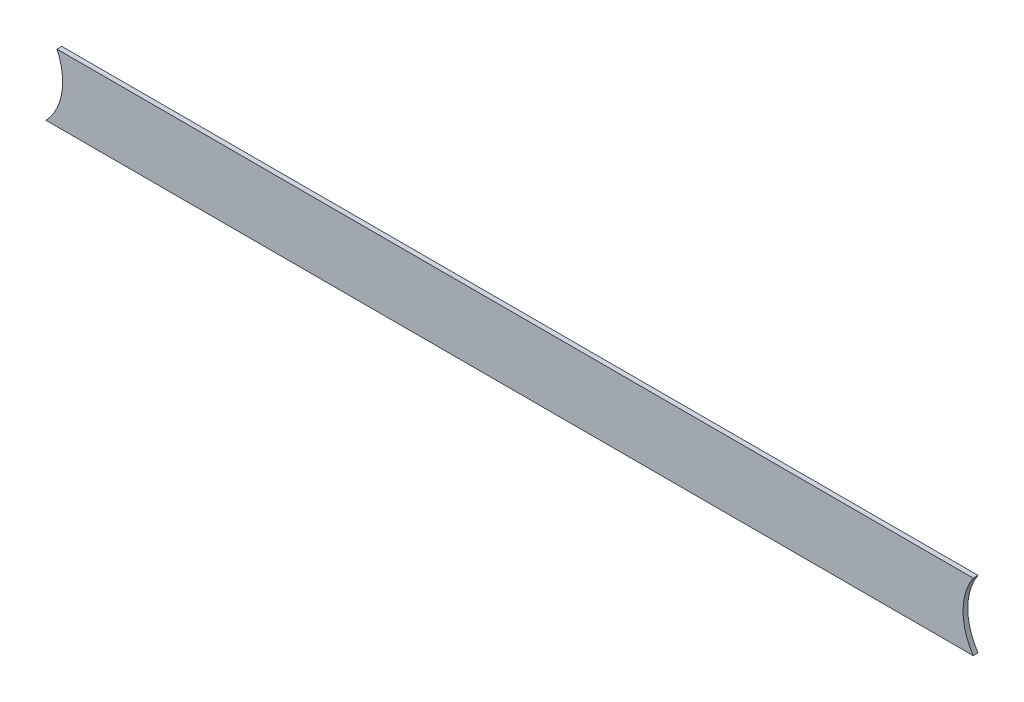
ISO-10303-21;
HEADER;
FILE_DESCRIPTION(('STEP AP214'),'2;1');
FILE_NAME('part.step','',(''),(''),'','','');
FILE_SCHEMA(('AUTOMOTIVE_DESIGN { 1 0 10303 214 1 1 1 1 }'));
ENDSEC;
DATA;
#1=APPLICATION_CONTEXT('core data for automotive mechanical design processes');
#2=APPLICATION_PROTOCOL_DEFINITION('international standard','automotive_design',2000,#1);
#3=PRODUCT_CONTEXT('',#1,'mechanical');
#4=PRODUCT('Part','Part','',(#3));
#5=PRODUCT_RELATED_PRODUCT_CATEGORY('part','',(#4));
#6=PRODUCT_DEFINITION_FORMATION('','',#4);
#7=PRODUCT_DEFINITION_CONTEXT('part definition',#1,'design');
#8=PRODUCT_DEFINITION('design','',#6,#7);
#9=PRODUCT_DEFINITION_SHAPE('','',#8);
#10=(LENGTH_UNIT() NAMED_UNIT(*) SI_UNIT(.MILLI.,.METRE.));
#11=(NAMED_UNIT(*) PLANE_ANGLE_UNIT() SI_UNIT($,.RADIAN.));
#12=(NAMED_UNIT(*) SI_UNIT($,.STERADIAN.) SOLID_ANGLE_UNIT());
#13=UNCERTAINTY_MEASURE_WITH_UNIT(LENGTH_MEASURE(1.E-05),#10,'distance_accuracy_value','');
#14=(GEOMETRIC_REPRESENTATION_CONTEXT(3) GLOBAL_UNCERTAINTY_ASSIGNED_CONTEXT((#13)) GLOBAL_UNIT_ASSIGNED_CONTEXT((#10,
#11,#12)) REPRESENTATION_CONTEXT('',''));
#15=CARTESIAN_POINT('',(0.,0.,0.));
#16=DIRECTION('',(0.,0.,1.));
#17=DIRECTION('',(1.,0.,0.));
#18=AXIS2_PLACEMENT_3D('',#15,#16,#17);
#19=CARTESIAN_POINT('',(36.1832219040097,68.1500161,0.));
#20=DIRECTION('',(0.,1.,0.));
#21=DIRECTION('',(1.,0.,0.));
#22=AXIS2_PLACEMENT_3D('',#19,#20,#21);
#23=PLANE('',#22);
#24=DIRECTION('',(1.,0.,0.));
#25=VECTOR('',#24,1.);
#26=CARTESIAN_POINT('',(35.9170224,68.1500161,0.03556));
#27=LINE('',#26,#25);
#28=CARTESIAN_POINT('',(36.1832219040096,68.1500161,0.03556));
#29=VERTEX_POINT('',#28);
#30=CARTESIAN_POINT('',(43.0858446096541,68.1500161,0.03556));
#31=VERTEX_POINT('',#30);
#32=EDGE_CURVE('E11',#29,#31,#27,.T.);
#33=ORIENTED_EDGE('',*,*,#32,.F.);
#34=DIRECTION('',(0.,0.,1.));
#35=VECTOR('',#34,1.);
#36=CARTESIAN_POINT('',(36.1832219040096,68.1500161,0.));
#37=LINE('',#36,#35);
#38=CARTESIAN_POINT('',(36.1832219040096,68.1500161,0.));
#39=VERTEX_POINT('',#38);
#40=EDGE_CURVE('E24',#39,#29,#37,.T.);
#41=ORIENTED_EDGE('',*,*,#40,.F.);
#42=DIRECTION('',(1.,0.,0.));
#43=VECTOR('',#42,1.);
#44=CARTESIAN_POINT('',(35.9170224,68.1500161,0.));
#45=LINE('',#44,#43);
#46=CARTESIAN_POINT('',(43.0858446096541,68.1500161,0.));
#47=VERTEX_POINT('',#46);
#48=EDGE_CURVE('E82',#39,#47,#45,.T.);
#49=ORIENTED_EDGE('',*,*,#48,.T.);
#50=DIRECTION('',(0.,0.,1.));
#51=VECTOR('',#50,1.);
#52=CARTESIAN_POINT('',(43.0858446096541,68.1500161,0.));
#53=LINE('',#52,#51);
#54=EDGE_CURVE('E37',#47,#31,#53,.T.);
#55=ORIENTED_EDGE('',*,*,#54,.T.);
#56=EDGE_LOOP('',(#33,#41,#49,#55));
#57=FACE_BOUND('',#56,.T.);
#58=ADVANCED_FACE('F17',(#57),#23,.F.);
#59=CARTESIAN_POINT('',(43.4600096,68.4000156,0.));
#60=DIRECTION('',(0.,0.,-1.));
#61=DIRECTION('',(1.,0.,0.));
#62=AXIS2_PLACEMENT_3D('',#59,#60,#61);
#63=CYLINDRICAL_SURFACE('',#62,0.4499991);
#64=DIRECTION('',(0.,0.,1.));
#65=VECTOR('',#64,1.);
#66=CARTESIAN_POINT('',(43.0858446096541,68.6500151,0.));
#67=LINE('',#66,#65);
#68=CARTESIAN_POINT('',(43.0858446096541,68.6500151,0.));
#69=VERTEX_POINT('',#68);
#70=CARTESIAN_POINT('',(43.0858446096541,68.6500151,0.03556));
#71=VERTEX_POINT('',#70);
#72=EDGE_CURVE('E97',#69,#71,#67,.T.);
#73=ORIENTED_EDGE('',*,*,#72,.T.);
#74=CARTESIAN_POINT('',(43.4600096,68.4000156,0.03556));
#75=DIRECTION('',(0.,0.,1.));
#76=DIRECTION('',(1.,0.,0.));
#77=AXIS2_PLACEMENT_3D('',#74,#75,#76);
#78=CIRCLE('',#77,0.4499991);
#79=EDGE_CURVE('E94',#71,#31,#78,.T.);
#80=ORIENTED_EDGE('',*,*,#79,.T.);
#81=ORIENTED_EDGE('',*,*,#54,.F.);
#82=CARTESIAN_POINT('',(43.4600096,68.4000156,0.));
#83=DIRECTION('',(0.,0.,1.));
#84=DIRECTION('',(1.,0.,0.));
#85=AXIS2_PLACEMENT_3D('',#82,#83,#84);
#86=CIRCLE('',#85,0.4499991);
#87=EDGE_CURVE('E92',#69,#47,#86,.T.);
#88=ORIENTED_EDGE('',*,*,#87,.F.);
#89=EDGE_LOOP('',(#73,#80,#81,#88));
#90=FACE_BOUND('',#89,.T.);
#91=ADVANCED_FACE('F102',(#90),#63,.F.);
#92=CARTESIAN_POINT('',(43.0858446096541,68.6500151,0.));
#93=DIRECTION('',(0.,-1.,0.));
#94=DIRECTION('',(-1.,0.,0.));
#95=AXIS2_PLACEMENT_3D('',#92,#93,#94);
#96=PLANE('',#95);
#97=DIRECTION('',(-1.,0.,0.));
#98=VECTOR('',#97,1.);
#99=CARTESIAN_POINT('',(43.4600096,68.6500151,0.03556));
#100=LINE('',#99,#98);
#101=CARTESIAN_POINT('',(36.2649459790646,68.6500151,0.03556));
#102=VERTEX_POINT('',#101);
#103=EDGE_CURVE('E89',#71,#102,#100,.T.);
#104=ORIENTED_EDGE('',*,*,#103,.F.);
#105=ORIENTED_EDGE('',*,*,#72,.F.);
#106=DIRECTION('',(-1.,0.,0.));
#107=VECTOR('',#106,1.);
#108=CARTESIAN_POINT('',(43.4600096,68.6500151,0.));
#109=LINE('',#108,#107);
#110=CARTESIAN_POINT('',(36.2649459790646,68.6500151,0.));
#111=VERTEX_POINT('',#110);
#112=EDGE_CURVE('E87',#69,#111,#109,.T.);
#113=ORIENTED_EDGE('',*,*,#112,.T.);
#114=DIRECTION('',(0.,0.,1.));
#115=VECTOR('',#114,1.);
#116=CARTESIAN_POINT('',(36.2649459790646,68.6500151,0.));
#117=LINE('',#116,#115);
#118=EDGE_CURVE('E69',#111,#102,#117,.T.);
#119=ORIENTED_EDGE('',*,*,#118,.T.);
#120=EDGE_LOOP('',(#104,#105,#113,#119));
#121=FACE_BOUND('',#120,.T.);
#122=ADVANCED_FACE('F108',(#121),#96,.F.);
#123=CARTESIAN_POINT('',(35.8570276,68.4600104,0.));
#124=DIRECTION('',(0.,0.,-1.));
#125=DIRECTION('',(1.,0.,0.));
#126=AXIS2_PLACEMENT_3D('',#123,#124,#125);
#127=CYLINDRICAL_SURFACE('',#126,0.4499991);
#128=DIRECTION('',(0.,0.,1.));
#129=VECTOR('',#128,1.);
#130=CARTESIAN_POINT('',(36.3070267,68.4600104,0.));
#131=LINE('',#130,#129);
#132=CARTESIAN_POINT('',(36.3070267,68.4600104,0.));
#133=VERTEX_POINT('',#132);
#134=CARTESIAN_POINT('',(36.3070267,68.4600104,0.03556));
#135=VERTEX_POINT('',#134);
#136=EDGE_CURVE('E59',#133,#135,#131,.T.);
#137=ORIENTED_EDGE('',*,*,#136,.T.);
#138=CARTESIAN_POINT('',(35.8570276,68.4600104,0.03556));
#139=DIRECTION('',(0.,0.,1.));
#140=DIRECTION('',(1.,0.,0.));
#141=AXIS2_PLACEMENT_3D('',#138,#139,#140);
#142=CIRCLE('',#141,0.4499991);
#143=EDGE_CURVE('E70',#135,#102,#142,.T.);
#144=ORIENTED_EDGE('',*,*,#143,.T.);
#145=ORIENTED_EDGE('',*,*,#118,.F.);
#146=CARTESIAN_POINT('',(35.8570276,68.4600104,0.));
#147=DIRECTION('',(0.,0.,1.));
#148=DIRECTION('',(1.,0.,0.));
#149=AXIS2_PLACEMENT_3D('',#146,#147,#148);
#150=CIRCLE('',#149,0.4499991);
#151=EDGE_CURVE('E73',#133,#111,#150,.T.);
#152=ORIENTED_EDGE('',*,*,#151,.F.);
#153=EDGE_LOOP('',(#137,#144,#145,#152));
#154=FACE_BOUND('',#153,.T.);
#155=ADVANCED_FACE('F74',(#154),#127,.F.);
#156=CARTESIAN_POINT('',(35.8570276,68.4600104,0.));
#157=DIRECTION('',(0.,0.,-1.));
#158=DIRECTION('',(1.,0.,0.));
#159=AXIS2_PLACEMENT_3D('',#156,#157,#158);
#160=CYLINDRICAL_SURFACE('',#159,0.4499991);
#161=ORIENTED_EDGE('',*,*,#40,.T.);
#162=CARTESIAN_POINT('',(35.8570276,68.4600104,0.03556));
#163=DIRECTION('',(0.,0.,1.));
#164=DIRECTION('',(1.,0.,0.));
#165=AXIS2_PLACEMENT_3D('',#162,#163,#164);
#166=CIRCLE('',#165,0.4499991);
#167=EDGE_CURVE('E65',#29,#135,#166,.T.);
#168=ORIENTED_EDGE('',*,*,#167,.T.);
#169=ORIENTED_EDGE('',*,*,#136,.F.);
#170=EDGE_CURVE('E63',#39,#133,#150,.T.);
#171=ORIENTED_EDGE('',*,*,#170,.F.);
#172=EDGE_LOOP('',(#161,#168,#169,#171));
#173=FACE_BOUND('',#172,.T.);
#174=ADVANCED_FACE('F61',(#173),#160,.F.);
#175=CARTESIAN_POINT('',(35.9170224,68.1500161,0.));
#176=DIRECTION('',(0.,0.,-1.));
#177=DIRECTION('',(-1.,0.,0.));
#178=AXIS2_PLACEMENT_3D('',#175,#176,#177);
#179=PLANE('',#178);
#180=ORIENTED_EDGE('',*,*,#48,.F.);
#181=ORIENTED_EDGE('',*,*,#170,.T.);
#182=ORIENTED_EDGE('',*,*,#151,.T.);
#183=ORIENTED_EDGE('',*,*,#112,.F.);
#184=ORIENTED_EDGE('',*,*,#87,.T.);
#185=EDGE_LOOP('',(#180,#181,#182,#183,#184));
#186=FACE_BOUND('',#185,.T.);
#187=ADVANCED_FACE('F80',(#186),#179,.T.);
#188=CARTESIAN_POINT('',(35.9170224,68.1500161,0.03556));
#189=DIRECTION('',(0.,0.,-1.));
#190=DIRECTION('',(-1.,0.,0.));
#191=AXIS2_PLACEMENT_3D('',#188,#189,#190);
#192=PLANE('',#191);
#193=ORIENTED_EDGE('',*,*,#167,.F.);
#194=ORIENTED_EDGE('',*,*,#32,.T.);
#195=ORIENTED_EDGE('',*,*,#79,.F.);
#196=ORIENTED_EDGE('',*,*,#103,.T.);
#197=ORIENTED_EDGE('',*,*,#143,.F.);
#198=EDGE_LOOP('',(#193,#194,#195,#196,#197));
#199=FACE_BOUND('',#198,.T.);
#200=ADVANCED_FACE('F106',(#199),#192,.F.);
#201=CLOSED_SHELL('',(#58,#91,#122,#155,#174,#187,#200));
#202=MANIFOLD_SOLID_BREP('B1',#201);
#203=ADVANCED_BREP_SHAPE_REPRESENTATION('',(#18,#202),#14);
#204=SHAPE_DEFINITION_REPRESENTATION(#9,#203);
ENDSEC;
END-ISO-10303-21;
